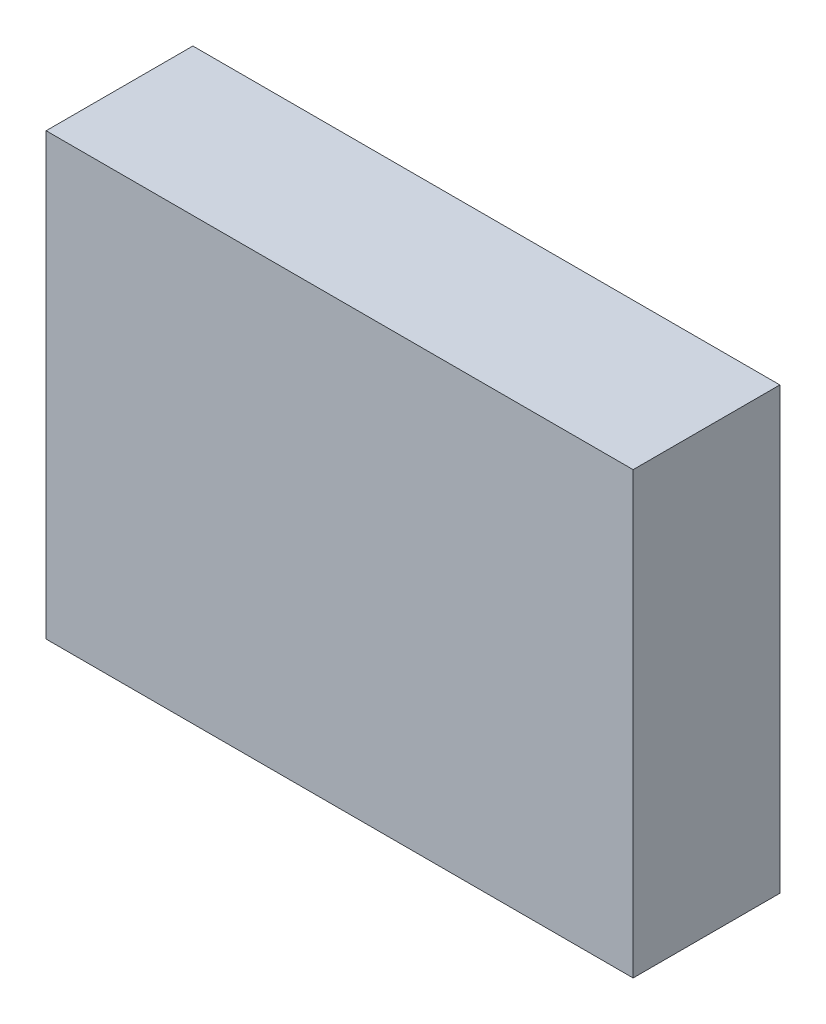
ISO-10303-21;
HEADER;
FILE_DESCRIPTION(('STEP AP214'),'2;1');
FILE_NAME('part.step','',(''),(''),'','','');
FILE_SCHEMA(('AUTOMOTIVE_DESIGN { 1 0 10303 214 1 1 1 1 }'));
ENDSEC;
DATA;
#1=APPLICATION_CONTEXT('core data for automotive mechanical design processes');
#2=APPLICATION_PROTOCOL_DEFINITION('international standard','automotive_design',2000,#1);
#3=PRODUCT_CONTEXT('',#1,'mechanical');
#4=PRODUCT('Part','Part','',(#3));
#5=PRODUCT_RELATED_PRODUCT_CATEGORY('part','',(#4));
#6=PRODUCT_DEFINITION_FORMATION('','',#4);
#7=PRODUCT_DEFINITION_CONTEXT('part definition',#1,'design');
#8=PRODUCT_DEFINITION('design','',#6,#7);
#9=PRODUCT_DEFINITION_SHAPE('','',#8);
#10=(LENGTH_UNIT() NAMED_UNIT(*) SI_UNIT(.MILLI.,.METRE.));
#11=(NAMED_UNIT(*) PLANE_ANGLE_UNIT() SI_UNIT($,.RADIAN.));
#12=(NAMED_UNIT(*) SI_UNIT($,.STERADIAN.) SOLID_ANGLE_UNIT());
#13=UNCERTAINTY_MEASURE_WITH_UNIT(LENGTH_MEASURE(1.E-05),#10,'distance_accuracy_value','');
#14=(GEOMETRIC_REPRESENTATION_CONTEXT(3) GLOBAL_UNCERTAINTY_ASSIGNED_CONTEXT((#13)) GLOBAL_UNIT_ASSIGNED_CONTEXT((#10,
#11,#12)) REPRESENTATION_CONTEXT('',''));
#15=CARTESIAN_POINT('',(0.,0.,0.));
#16=DIRECTION('',(0.,0.,1.));
#17=DIRECTION('',(1.,0.,0.));
#18=AXIS2_PLACEMENT_3D('',#15,#16,#17);
#19=CARTESIAN_POINT('',(-60.,0.,0.));
#20=DIRECTION('',(0.,-1.,0.));
#21=DIRECTION('',(0.,0.,-1.));
#22=AXIS2_PLACEMENT_3D('',#19,#20,#21);
#23=PLANE('',#22);
#24=DIRECTION('',(1.,0.,0.));
#25=VECTOR('',#24,1.);
#26=CARTESIAN_POINT('',(-60.,0.,30.));
#27=LINE('',#26,#25);
#28=CARTESIAN_POINT('',(-60.,0.,30.));
#29=VERTEX_POINT('',#28);
#30=CARTESIAN_POINT('',(60.,0.,30.));
#31=VERTEX_POINT('',#30);
#32=EDGE_CURVE('E46',#29,#31,#27,.T.);
#33=ORIENTED_EDGE('',*,*,#32,.T.);
#34=DIRECTION('',(0.,0.,-1.));
#35=VECTOR('',#34,1.);
#36=CARTESIAN_POINT('',(60.,0.,0.));
#37=LINE('',#36,#35);
#38=CARTESIAN_POINT('',(60.,0.,0.));
#39=VERTEX_POINT('',#38);
#40=EDGE_CURVE('E190',#31,#39,#37,.T.);
#41=ORIENTED_EDGE('',*,*,#40,.T.);
#42=DIRECTION('',(1.,0.,0.));
#43=VECTOR('',#42,1.);
#44=CARTESIAN_POINT('',(-60.,0.,0.));
#45=LINE('',#44,#43);
#46=CARTESIAN_POINT('',(-60.,0.,0.));
#47=VERTEX_POINT('',#46);
#48=EDGE_CURVE('E11',#47,#39,#45,.T.);
#49=ORIENTED_EDGE('',*,*,#48,.F.);
#50=DIRECTION('',(0.,0.,-1.));
#51=VECTOR('',#50,1.);
#52=CARTESIAN_POINT('',(-60.,0.,0.));
#53=LINE('',#52,#51);
#54=EDGE_CURVE('E56',#29,#47,#53,.T.);
#55=ORIENTED_EDGE('',*,*,#54,.F.);
#56=EDGE_LOOP('',(#33,#41,#49,#55));
#57=FACE_BOUND('',#56,.T.);
#58=ADVANCED_FACE('F43',(#57),#23,.F.);
#59=CARTESIAN_POINT('',(-60.,0.,0.));
#60=DIRECTION('',(0.,0.,-1.));
#61=DIRECTION('',(0.,1.,0.));
#62=AXIS2_PLACEMENT_3D('',#59,#60,#61);
#63=PLANE('',#62);
#64=CARTESIAN_POINT('',(-2.99999999999999,-17.5,0.));
#65=DIRECTION('',(0.,0.,-1.));
#66=DIRECTION('',(0.,1.,0.));
#67=AXIS2_PLACEMENT_3D('',#64,#65,#66);
#68=CIRCLE('',#67,1.025);
#69=CARTESIAN_POINT('',(-2.99999999999999,-16.475,0.));
#70=VERTEX_POINT('',#69);
#71=EDGE_CURVE('E121',#70,#70,#68,.T.);
#72=ORIENTED_EDGE('',*,*,#71,.F.);
#73=EDGE_LOOP('',(#72));
#74=FACE_BOUND('',#73,.T.);
#75=CARTESIAN_POINT('',(3.00000000000001,-17.5,0.));
#76=DIRECTION('',(0.,0.,-1.));
#77=DIRECTION('',(0.,1.,0.));
#78=AXIS2_PLACEMENT_3D('',#75,#76,#77);
#79=CIRCLE('',#78,1.025);
#80=CARTESIAN_POINT('',(3.00000000000001,-16.475,0.));
#81=VERTEX_POINT('',#80);
#82=EDGE_CURVE('E120',#81,#81,#79,.T.);
#83=ORIENTED_EDGE('',*,*,#82,.F.);
#84=EDGE_LOOP('',(#83));
#85=FACE_BOUND('',#84,.T.);
#86=CARTESIAN_POINT('',(3.00000000000001,-2.50000000000004,0.));
#87=DIRECTION('',(0.,0.,-1.));
#88=DIRECTION('',(0.,1.,0.));
#89=AXIS2_PLACEMENT_3D('',#86,#87,#88);
#90=CIRCLE('',#89,1.025);
#91=CARTESIAN_POINT('',(3.00000000000001,-1.47500000000004,0.));
#92=VERTEX_POINT('',#91);
#93=EDGE_CURVE('E131',#92,#92,#90,.T.);
#94=ORIENTED_EDGE('',*,*,#93,.F.);
#95=EDGE_LOOP('',(#94));
#96=FACE_BOUND('',#95,.T.);
#97=CARTESIAN_POINT('',(-2.99999999999999,-2.50000000000004,0.));
#98=DIRECTION('',(0.,0.,-1.));
#99=DIRECTION('',(0.,1.,0.));
#100=AXIS2_PLACEMENT_3D('',#97,#98,#99);
#101=CIRCLE('',#100,1.025);
#102=CARTESIAN_POINT('',(-2.99999999999999,-1.47500000000004,0.));
#103=VERTEX_POINT('',#102);
#104=EDGE_CURVE('E145',#103,#103,#101,.T.);
#105=ORIENTED_EDGE('',*,*,#104,.F.);
#106=EDGE_LOOP('',(#105));
#107=FACE_BOUND('',#106,.T.);
#108=CARTESIAN_POINT('',(-7.49999999999999,-61.,0.));
#109=DIRECTION('',(0.,0.,-1.));
#110=DIRECTION('',(0.,1.,0.));
#111=AXIS2_PLACEMENT_3D('',#108,#109,#110);
#112=CIRCLE('',#111,1.025);
#113=CARTESIAN_POINT('',(-7.49999999999999,-59.975,0.));
#114=VERTEX_POINT('',#113);
#115=EDGE_CURVE('E153',#114,#114,#112,.T.);
#116=ORIENTED_EDGE('',*,*,#115,.F.);
#117=EDGE_LOOP('',(#116));
#118=FACE_BOUND('',#117,.T.);
#119=CARTESIAN_POINT('',(-7.49999999999999,-29.,0.));
#120=DIRECTION('',(0.,0.,-1.));
#121=DIRECTION('',(0.,1.,0.));
#122=AXIS2_PLACEMENT_3D('',#119,#120,#121);
#123=CIRCLE('',#122,1.025);
#124=CARTESIAN_POINT('',(-7.49999999999999,-27.975,0.));
#125=VERTEX_POINT('',#124);
#126=EDGE_CURVE('E159',#125,#125,#123,.T.);
#127=ORIENTED_EDGE('',*,*,#126,.F.);
#128=EDGE_LOOP('',(#127));
#129=FACE_BOUND('',#128,.T.);
#130=CARTESIAN_POINT('',(7.50000000000001,-61.,0.));
#131=DIRECTION('',(0.,0.,-1.));
#132=DIRECTION('',(0.,1.,0.));
#133=AXIS2_PLACEMENT_3D('',#130,#131,#132);
#134=CIRCLE('',#133,1.025);
#135=CARTESIAN_POINT('',(7.50000000000001,-59.975,0.));
#136=VERTEX_POINT('',#135);
#137=EDGE_CURVE('E169',#136,#136,#134,.T.);
#138=ORIENTED_EDGE('',*,*,#137,.F.);
#139=EDGE_LOOP('',(#138));
#140=FACE_BOUND('',#139,.T.);
#141=CARTESIAN_POINT('',(7.50000000000001,-29.,0.));
#142=DIRECTION('',(0.,0.,-1.));
#143=DIRECTION('',(0.,1.,0.));
#144=AXIS2_PLACEMENT_3D('',#141,#142,#143);
#145=CIRCLE('',#144,1.025);
#146=CARTESIAN_POINT('',(7.50000000000001,-27.975,0.));
#147=VERTEX_POINT('',#146);
#148=EDGE_CURVE('E178',#147,#147,#145,.T.);
#149=ORIENTED_EDGE('',*,*,#148,.F.);
#150=EDGE_LOOP('',(#149));
#151=FACE_BOUND('',#150,.T.);
#152=ORIENTED_EDGE('',*,*,#48,.T.);
#153=DIRECTION('',(0.,1.,0.));
#154=VECTOR('',#153,1.);
#155=CARTESIAN_POINT('',(60.,0.,0.));
#156=LINE('',#155,#154);
#157=CARTESIAN_POINT('',(60.,-90.,0.));
#158=VERTEX_POINT('',#157);
#159=EDGE_CURVE('E198',#158,#39,#156,.T.);
#160=ORIENTED_EDGE('',*,*,#159,.F.);
#161=DIRECTION('',(1.,0.,0.));
#162=VECTOR('',#161,1.);
#163=CARTESIAN_POINT('',(-60.,-90.,0.));
#164=LINE('',#163,#162);
#165=CARTESIAN_POINT('',(-60.,-90.,0.));
#166=VERTEX_POINT('',#165);
#167=EDGE_CURVE('E51',#166,#158,#164,.T.);
#168=ORIENTED_EDGE('',*,*,#167,.F.);
#169=DIRECTION('',(0.,1.,0.));
#170=VECTOR('',#169,1.);
#171=CARTESIAN_POINT('',(-60.,0.,0.));
#172=LINE('',#171,#170);
#173=EDGE_CURVE('E203',#166,#47,#172,.T.);
#174=ORIENTED_EDGE('',*,*,#173,.T.);
#175=EDGE_LOOP('',(#152,#160,#168,#174));
#176=FACE_BOUND('',#175,.T.);
#177=ADVANCED_FACE('F224',(#74,#85,#96,#107,#118,#129,#140,#151,#176),#63,.T.);
#178=CARTESIAN_POINT('',(-60.,-90.,0.));
#179=DIRECTION('',(0.,-1.,0.));
#180=DIRECTION('',(0.,0.,-1.));
#181=AXIS2_PLACEMENT_3D('',#178,#179,#180);
#182=PLANE('',#181);
#183=ORIENTED_EDGE('',*,*,#167,.T.);
#184=DIRECTION('',(0.,0.,-1.));
#185=VECTOR('',#184,1.);
#186=CARTESIAN_POINT('',(60.,-90.,0.));
#187=LINE('',#186,#185);
#188=CARTESIAN_POINT('',(60.,-90.,30.));
#189=VERTEX_POINT('',#188);
#190=EDGE_CURVE('E195',#189,#158,#187,.T.);
#191=ORIENTED_EDGE('',*,*,#190,.F.);
#192=DIRECTION('',(1.,0.,0.));
#193=VECTOR('',#192,1.);
#194=CARTESIAN_POINT('',(-60.,-90.,30.));
#195=LINE('',#194,#193);
#196=CARTESIAN_POINT('',(-60.,-90.,30.));
#197=VERTEX_POINT('',#196);
#198=EDGE_CURVE('E207',#197,#189,#195,.T.);
#199=ORIENTED_EDGE('',*,*,#198,.F.);
#200=DIRECTION('',(0.,0.,-1.));
#201=VECTOR('',#200,1.);
#202=CARTESIAN_POINT('',(-60.,-90.,0.));
#203=LINE('',#202,#201);
#204=EDGE_CURVE('E205',#197,#166,#203,.T.);
#205=ORIENTED_EDGE('',*,*,#204,.T.);
#206=EDGE_LOOP('',(#183,#191,#199,#205));
#207=FACE_BOUND('',#206,.T.);
#208=ADVANCED_FACE('F217',(#207),#182,.T.);
#209=CARTESIAN_POINT('',(-60.,0.,30.));
#210=DIRECTION('',(0.,0.,-1.));
#211=DIRECTION('',(-1.,0.,0.));
#212=AXIS2_PLACEMENT_3D('',#209,#210,#211);
#213=PLANE('',#212);
#214=ORIENTED_EDGE('',*,*,#198,.T.);
#215=DIRECTION('',(0.,1.,0.));
#216=VECTOR('',#215,1.);
#217=CARTESIAN_POINT('',(60.,0.,30.));
#218=LINE('',#217,#216);
#219=EDGE_CURVE('E188',#189,#31,#218,.T.);
#220=ORIENTED_EDGE('',*,*,#219,.T.);
#221=ORIENTED_EDGE('',*,*,#32,.F.);
#222=DIRECTION('',(0.,1.,0.));
#223=VECTOR('',#222,1.);
#224=CARTESIAN_POINT('',(-60.,0.,30.));
#225=LINE('',#224,#223);
#226=EDGE_CURVE('E199',#197,#29,#225,.T.);
#227=ORIENTED_EDGE('',*,*,#226,.F.);
#228=EDGE_LOOP('',(#214,#220,#221,#227));
#229=FACE_BOUND('',#228,.T.);
#230=ADVANCED_FACE('F218',(#229),#213,.F.);
#231=CARTESIAN_POINT('',(-60.,0.,0.));
#232=DIRECTION('',(1.,0.,0.));
#233=DIRECTION('',(0.,0.,-1.));
#234=AXIS2_PLACEMENT_3D('',#231,#232,#233);
#235=PLANE('',#234);
#236=ORIENTED_EDGE('',*,*,#54,.T.);
#237=ORIENTED_EDGE('',*,*,#173,.F.);
#238=ORIENTED_EDGE('',*,*,#204,.F.);
#239=ORIENTED_EDGE('',*,*,#226,.T.);
#240=EDGE_LOOP('',(#236,#237,#238,#239));
#241=FACE_BOUND('',#240,.T.);
#242=ADVANCED_FACE('F216',(#241),#235,.F.);
#243=CARTESIAN_POINT('',(60.,0.,0.));
#244=DIRECTION('',(1.,0.,0.));
#245=DIRECTION('',(0.,0.,-1.));
#246=AXIS2_PLACEMENT_3D('',#243,#244,#245);
#247=PLANE('',#246);
#248=ORIENTED_EDGE('',*,*,#40,.F.);
#249=ORIENTED_EDGE('',*,*,#219,.F.);
#250=ORIENTED_EDGE('',*,*,#190,.T.);
#251=ORIENTED_EDGE('',*,*,#159,.T.);
#252=EDGE_LOOP('',(#248,#249,#250,#251));
#253=FACE_BOUND('',#252,.T.);
#254=ADVANCED_FACE('F212',(#253),#247,.T.);
#255=CARTESIAN_POINT('',(7.50000000000001,-29.,10.));
#256=DIRECTION('',(0.,0.,-1.));
#257=DIRECTION('',(0.,1.,0.));
#258=AXIS2_PLACEMENT_3D('',#255,#256,#257);
#259=CONICAL_SURFACE('',#258,0.999999999999997,1.02974425867665);
#260=CARTESIAN_POINT('',(7.5,-29.,10.6008606190276));
#261=VERTEX_POINT('',#260);
#262=VERTEX_LOOP('',#261);
#263=FACE_BOUND('',#262,.T.);
#264=CARTESIAN_POINT('',(7.50000000000001,-29.,10.));
#265=DIRECTION('',(0.,0.,-1.));
#266=DIRECTION('',(0.,1.,0.));
#267=AXIS2_PLACEMENT_3D('',#264,#265,#266);
#268=CIRCLE('',#267,0.999999999999997);
#269=CARTESIAN_POINT('',(7.50000000000001,-28.,10.));
#270=VERTEX_POINT('',#269);
#271=EDGE_CURVE('E183',#270,#270,#268,.T.);
#272=ORIENTED_EDGE('',*,*,#271,.T.);
#273=EDGE_LOOP('',(#272));
#274=FACE_BOUND('',#273,.T.);
#275=ADVANCED_FACE('F243',(#263,#274),#259,.F.);
#276=CARTESIAN_POINT('',(7.50000000000001,-29.,0.));
#277=DIRECTION('',(0.,0.,-1.));
#278=DIRECTION('',(0.,1.,0.));
#279=AXIS2_PLACEMENT_3D('',#276,#277,#278);
#280=CYLINDRICAL_SURFACE('',#279,0.999999999999992);
#281=ORIENTED_EDGE('',*,*,#271,.F.);
#282=EDGE_LOOP('',(#281));
#283=FACE_BOUND('',#282,.T.);
#284=CARTESIAN_POINT('',(7.50000000000001,-29.,0.0250000000000253));
#285=DIRECTION('',(0.,0.,-1.));
#286=DIRECTION('',(0.,1.,0.));
#287=AXIS2_PLACEMENT_3D('',#284,#285,#286);
#288=CIRCLE('',#287,0.999999999999988);
#289=CARTESIAN_POINT('',(7.50000000000001,-28.0000000000001,0.0250000000000248));
#290=VERTEX_POINT('',#289);
#291=EDGE_CURVE('E181',#290,#290,#288,.T.);
#292=ORIENTED_EDGE('',*,*,#291,.T.);
#293=EDGE_LOOP('',(#292));
#294=FACE_BOUND('',#293,.T.);
#295=ADVANCED_FACE('F246',(#283,#294),#280,.F.);
#296=CARTESIAN_POINT('',(7.50000000000001,-29.,0.));
#297=DIRECTION('',(0.,0.,-1.));
#298=DIRECTION('',(0.,1.,0.));
#299=AXIS2_PLACEMENT_3D('',#296,#297,#298);
#300=CONICAL_SURFACE('',#299,1.025,0.785398163397414);
#301=ORIENTED_EDGE('',*,*,#291,.F.);
#302=EDGE_LOOP('',(#301));
#303=FACE_BOUND('',#302,.T.);
#304=ORIENTED_EDGE('',*,*,#148,.T.);
#305=EDGE_LOOP('',(#304));
#306=FACE_BOUND('',#305,.T.);
#307=ADVANCED_FACE('F249',(#303,#306),#300,.F.);
#308=CARTESIAN_POINT('',(7.50000000000001,-61.,10.));
#309=DIRECTION('',(0.,0.,-1.));
#310=DIRECTION('',(0.,1.,0.));
#311=AXIS2_PLACEMENT_3D('',#308,#309,#310);
#312=CONICAL_SURFACE('',#311,0.999999999999997,1.02974425867665);
#313=CARTESIAN_POINT('',(7.5,-61.,10.6008606190276));
#314=VERTEX_POINT('',#313);
#315=VERTEX_LOOP('',#314);
#316=FACE_BOUND('',#315,.T.);
#317=CARTESIAN_POINT('',(7.50000000000001,-61.,10.));
#318=DIRECTION('',(0.,0.,-1.));
#319=DIRECTION('',(0.,1.,0.));
#320=AXIS2_PLACEMENT_3D('',#317,#318,#319);
#321=CIRCLE('',#320,0.999999999999997);
#322=CARTESIAN_POINT('',(7.50000000000001,-60.,10.));
#323=VERTEX_POINT('',#322);
#324=EDGE_CURVE('E174',#323,#323,#321,.T.);
#325=ORIENTED_EDGE('',*,*,#324,.T.);
#326=EDGE_LOOP('',(#325));
#327=FACE_BOUND('',#326,.T.);
#328=ADVANCED_FACE('F251',(#316,#327),#312,.F.);
#329=CARTESIAN_POINT('',(7.50000000000001,-61.,0.));
#330=DIRECTION('',(0.,0.,-1.));
#331=DIRECTION('',(0.,1.,0.));
#332=AXIS2_PLACEMENT_3D('',#329,#330,#331);
#333=CYLINDRICAL_SURFACE('',#332,0.999999999999992);
#334=ORIENTED_EDGE('',*,*,#324,.F.);
#335=EDGE_LOOP('',(#334));
#336=FACE_BOUND('',#335,.T.);
#337=CARTESIAN_POINT('',(7.50000000000001,-61.,0.025000000000041));
#338=DIRECTION('',(0.,0.,-1.));
#339=DIRECTION('',(0.,1.,0.));
#340=AXIS2_PLACEMENT_3D('',#337,#338,#339);
#341=CIRCLE('',#340,0.999999999999988);
#342=CARTESIAN_POINT('',(7.50000000000001,-60.0000000000001,0.0250000000000405));
#343=VERTEX_POINT('',#342);
#344=EDGE_CURVE('E175',#343,#343,#341,.T.);
#345=ORIENTED_EDGE('',*,*,#344,.T.);
#346=EDGE_LOOP('',(#345));
#347=FACE_BOUND('',#346,.T.);
#348=ADVANCED_FACE('F260',(#336,#347),#333,.F.);
#349=CARTESIAN_POINT('',(7.50000000000001,-61.,0.));
#350=DIRECTION('',(0.,0.,-1.));
#351=DIRECTION('',(0.,1.,0.));
#352=AXIS2_PLACEMENT_3D('',#349,#350,#351);
#353=CONICAL_SURFACE('',#352,1.025,0.785398163397414);
#354=ORIENTED_EDGE('',*,*,#344,.F.);
#355=EDGE_LOOP('',(#354));
#356=FACE_BOUND('',#355,.T.);
#357=ORIENTED_EDGE('',*,*,#137,.T.);
#358=EDGE_LOOP('',(#357));
#359=FACE_BOUND('',#358,.T.);
#360=ADVANCED_FACE('F265',(#356,#359),#353,.F.);
#361=CARTESIAN_POINT('',(-7.49999999999999,-29.,10.));
#362=DIRECTION('',(0.,0.,-1.));
#363=DIRECTION('',(0.,1.,0.));
#364=AXIS2_PLACEMENT_3D('',#361,#362,#363);
#365=CONICAL_SURFACE('',#364,0.999999999999997,1.02974425867665);
#366=CARTESIAN_POINT('',(-7.49999999999999,-29.,10.6008606190276));
#367=VERTEX_POINT('',#366);
#368=VERTEX_LOOP('',#367);
#369=FACE_BOUND('',#368,.T.);
#370=CARTESIAN_POINT('',(-7.49999999999999,-29.,10.));
#371=DIRECTION('',(0.,0.,-1.));
#372=DIRECTION('',(0.,1.,0.));
#373=AXIS2_PLACEMENT_3D('',#370,#371,#372);
#374=CIRCLE('',#373,0.999999999999997);
#375=CARTESIAN_POINT('',(-7.49999999999999,-28.,10.));
#376=VERTEX_POINT('',#375);
#377=EDGE_CURVE('E168',#376,#376,#374,.T.);
#378=ORIENTED_EDGE('',*,*,#377,.T.);
#379=EDGE_LOOP('',(#378));
#380=FACE_BOUND('',#379,.T.);
#381=ADVANCED_FACE('F266',(#369,#380),#365,.F.);
#382=CARTESIAN_POINT('',(-7.49999999999999,-29.,0.));
#383=DIRECTION('',(0.,0.,-1.));
#384=DIRECTION('',(0.,1.,0.));
#385=AXIS2_PLACEMENT_3D('',#382,#383,#384);
#386=CYLINDRICAL_SURFACE('',#385,0.999999999999993);
#387=ORIENTED_EDGE('',*,*,#377,.F.);
#388=EDGE_LOOP('',(#387));
#389=FACE_BOUND('',#388,.T.);
#390=CARTESIAN_POINT('',(-7.49999999999999,-29.,0.0250000000000253));
#391=DIRECTION('',(0.,0.,-1.));
#392=DIRECTION('',(0.,1.,0.));
#393=AXIS2_PLACEMENT_3D('',#390,#391,#392);
#394=CIRCLE('',#393,0.999999999999989);
#395=CARTESIAN_POINT('',(-7.49999999999999,-28.0000000000001,0.0250000000000248));
#396=VERTEX_POINT('',#395);
#397=EDGE_CURVE('E161',#396,#396,#394,.T.);
#398=ORIENTED_EDGE('',*,*,#397,.T.);
#399=EDGE_LOOP('',(#398));
#400=FACE_BOUND('',#399,.T.);
#401=ADVANCED_FACE('F269',(#389,#400),#386,.F.);
#402=CARTESIAN_POINT('',(-7.49999999999999,-29.,0.));
#403=DIRECTION('',(0.,0.,-1.));
#404=DIRECTION('',(0.,1.,0.));
#405=AXIS2_PLACEMENT_3D('',#402,#403,#404);
#406=CONICAL_SURFACE('',#405,1.025,0.785398163397414);
#407=ORIENTED_EDGE('',*,*,#397,.F.);
#408=EDGE_LOOP('',(#407));
#409=FACE_BOUND('',#408,.T.);
#410=ORIENTED_EDGE('',*,*,#126,.T.);
#411=EDGE_LOOP('',(#410));
#412=FACE_BOUND('',#411,.T.);
#413=ADVANCED_FACE('F274',(#409,#412),#406,.F.);
#414=CARTESIAN_POINT('',(-7.49999999999999,-61.,10.));
#415=DIRECTION('',(0.,0.,-1.));
#416=DIRECTION('',(0.,1.,0.));
#417=AXIS2_PLACEMENT_3D('',#414,#415,#416);
#418=CONICAL_SURFACE('',#417,0.999999999999997,1.02974425867665);
#419=CARTESIAN_POINT('',(-7.49999999999999,-61.,10.6008606190276));
#420=VERTEX_POINT('',#419);
#421=VERTEX_LOOP('',#420);
#422=FACE_BOUND('',#421,.T.);
#423=CARTESIAN_POINT('',(-7.49999999999999,-61.,10.));
#424=DIRECTION('',(0.,0.,-1.));
#425=DIRECTION('',(0.,1.,0.));
#426=AXIS2_PLACEMENT_3D('',#423,#424,#425);
#427=CIRCLE('',#426,0.999999999999997);
#428=CARTESIAN_POINT('',(-7.49999999999999,-60.,10.));
#429=VERTEX_POINT('',#428);
#430=EDGE_CURVE('E160',#429,#429,#427,.T.);
#431=ORIENTED_EDGE('',*,*,#430,.T.);
#432=EDGE_LOOP('',(#431));
#433=FACE_BOUND('',#432,.T.);
#434=ADVANCED_FACE('F280',(#422,#433),#418,.F.);
#435=CARTESIAN_POINT('',(-7.49999999999999,-61.,0.));
#436=DIRECTION('',(0.,0.,-1.));
#437=DIRECTION('',(0.,1.,0.));
#438=AXIS2_PLACEMENT_3D('',#435,#436,#437);
#439=CYLINDRICAL_SURFACE('',#438,0.999999999999993);
#440=ORIENTED_EDGE('',*,*,#430,.F.);
#441=EDGE_LOOP('',(#440));
#442=FACE_BOUND('',#441,.T.);
#443=CARTESIAN_POINT('',(-7.49999999999999,-61.,0.025000000000041));
#444=DIRECTION('',(0.,0.,-1.));
#445=DIRECTION('',(0.,1.,0.));
#446=AXIS2_PLACEMENT_3D('',#443,#444,#445);
#447=CIRCLE('',#446,0.999999999999989);
#448=CARTESIAN_POINT('',(-7.49999999999999,-60.0000000000001,0.0250000000000405));
#449=VERTEX_POINT('',#448);
#450=EDGE_CURVE('E152',#449,#449,#447,.T.);
#451=ORIENTED_EDGE('',*,*,#450,.T.);
#452=EDGE_LOOP('',(#451));
#453=FACE_BOUND('',#452,.T.);
#454=ADVANCED_FACE('F285',(#442,#453),#439,.F.);
#455=CARTESIAN_POINT('',(-7.49999999999999,-61.,0.));
#456=DIRECTION('',(0.,0.,-1.));
#457=DIRECTION('',(0.,1.,0.));
#458=AXIS2_PLACEMENT_3D('',#455,#456,#457);
#459=CONICAL_SURFACE('',#458,1.025,0.785398163397414);
#460=ORIENTED_EDGE('',*,*,#450,.F.);
#461=EDGE_LOOP('',(#460));
#462=FACE_BOUND('',#461,.T.);
#463=ORIENTED_EDGE('',*,*,#115,.T.);
#464=EDGE_LOOP('',(#463));
#465=FACE_BOUND('',#464,.T.);
#466=ADVANCED_FACE('F286',(#462,#465),#459,.F.);
#467=CARTESIAN_POINT('',(-2.99999999999999,-2.50000000000003,10.));
#468=DIRECTION('',(0.,0.,-1.));
#469=DIRECTION('',(0.,1.,0.));
#470=AXIS2_PLACEMENT_3D('',#467,#468,#469);
#471=CONICAL_SURFACE('',#470,0.999999999999987,1.02974425867664);
#472=CARTESIAN_POINT('',(-2.99999999999999,-2.50000000000003,10.6008606190276));
#473=VERTEX_POINT('',#472);
#474=VERTEX_LOOP('',#473);
#475=FACE_BOUND('',#474,.T.);
#476=CARTESIAN_POINT('',(-2.99999999999999,-2.50000000000003,10.));
#477=DIRECTION('',(0.,0.,-1.));
#478=DIRECTION('',(0.,1.,0.));
#479=AXIS2_PLACEMENT_3D('',#476,#477,#478);
#480=CIRCLE('',#479,0.999999999999987);
#481=CARTESIAN_POINT('',(-2.99999999999999,-1.50000000000005,10.));
#482=VERTEX_POINT('',#481);
#483=EDGE_CURVE('E150',#482,#482,#480,.T.);
#484=ORIENTED_EDGE('',*,*,#483,.T.);
#485=EDGE_LOOP('',(#484));
#486=FACE_BOUND('',#485,.T.);
#487=ADVANCED_FACE('F288',(#475,#486),#471,.F.);
#488=CARTESIAN_POINT('',(-2.99999999999999,-2.50000000000004,0.));
#489=DIRECTION('',(0.,0.,-1.));
#490=DIRECTION('',(0.,1.,0.));
#491=AXIS2_PLACEMENT_3D('',#488,#489,#490);
#492=CYLINDRICAL_SURFACE('',#491,0.999999999999988);
#493=ORIENTED_EDGE('',*,*,#483,.F.);
#494=EDGE_LOOP('',(#493));
#495=FACE_BOUND('',#494,.T.);
#496=CARTESIAN_POINT('',(-2.99999999999999,-2.50000000000004,0.0250000000000123));
#497=DIRECTION('',(0.,0.,-1.));
#498=DIRECTION('',(0.,1.,0.));
#499=AXIS2_PLACEMENT_3D('',#496,#497,#498);
#500=CIRCLE('',#499,0.999999999999989);
#501=CARTESIAN_POINT('',(-2.99999999999999,-1.50000000000005,0.0250000000000119));
#502=VERTEX_POINT('',#501);
#503=EDGE_CURVE('E143',#502,#502,#500,.T.);
#504=ORIENTED_EDGE('',*,*,#503,.T.);
#505=EDGE_LOOP('',(#504));
#506=FACE_BOUND('',#505,.T.);
#507=ADVANCED_FACE('F292',(#495,#506),#492,.F.);
#508=CARTESIAN_POINT('',(-2.99999999999999,-2.50000000000004,0.));
#509=DIRECTION('',(0.,0.,-1.));
#510=DIRECTION('',(0.,1.,0.));
#511=AXIS2_PLACEMENT_3D('',#508,#509,#510);
#512=CONICAL_SURFACE('',#511,1.025,0.785398163397414);
#513=ORIENTED_EDGE('',*,*,#503,.F.);
#514=EDGE_LOOP('',(#513));
#515=FACE_BOUND('',#514,.T.);
#516=ORIENTED_EDGE('',*,*,#104,.T.);
#517=EDGE_LOOP('',(#516));
#518=FACE_BOUND('',#517,.T.);
#519=ADVANCED_FACE('F298',(#515,#518),#512,.F.);
#520=CARTESIAN_POINT('',(3.00000000000001,-2.50000000000003,10.));
#521=DIRECTION('',(0.,0.,-1.));
#522=DIRECTION('',(0.,1.,0.));
#523=AXIS2_PLACEMENT_3D('',#520,#521,#522);
#524=CONICAL_SURFACE('',#523,0.999999999999987,1.02974425867664);
#525=CARTESIAN_POINT('',(3.,-2.50000000000003,10.6008606190276));
#526=VERTEX_POINT('',#525);
#527=VERTEX_LOOP('',#526);
#528=FACE_BOUND('',#527,.T.);
#529=CARTESIAN_POINT('',(3.00000000000001,-2.50000000000003,10.));
#530=DIRECTION('',(0.,0.,-1.));
#531=DIRECTION('',(0.,1.,0.));
#532=AXIS2_PLACEMENT_3D('',#529,#530,#531);
#533=CIRCLE('',#532,0.999999999999987);
#534=CARTESIAN_POINT('',(3.00000000000001,-1.50000000000005,10.));
#535=VERTEX_POINT('',#534);
#536=EDGE_CURVE('E138',#535,#535,#533,.T.);
#537=ORIENTED_EDGE('',*,*,#536,.T.);
#538=EDGE_LOOP('',(#537));
#539=FACE_BOUND('',#538,.T.);
#540=ADVANCED_FACE('F297',(#528,#539),#524,.F.);
#541=CARTESIAN_POINT('',(3.00000000000001,-2.50000000000004,0.));
#542=DIRECTION('',(0.,0.,-1.));
#543=DIRECTION('',(0.,1.,0.));
#544=AXIS2_PLACEMENT_3D('',#541,#542,#543);
#545=CYLINDRICAL_SURFACE('',#544,0.999999999999987);
#546=ORIENTED_EDGE('',*,*,#536,.F.);
#547=EDGE_LOOP('',(#546));
#548=FACE_BOUND('',#547,.T.);
#549=CARTESIAN_POINT('',(3.00000000000001,-2.50000000000004,0.0250000000000123));
#550=DIRECTION('',(0.,0.,-1.));
#551=DIRECTION('',(0.,1.,0.));
#552=AXIS2_PLACEMENT_3D('',#549,#550,#551);
#553=CIRCLE('',#552,0.999999999999988);
#554=CARTESIAN_POINT('',(3.00000000000001,-1.50000000000005,0.0250000000000119));
#555=VERTEX_POINT('',#554);
#556=EDGE_CURVE('E136',#555,#555,#553,.T.);
#557=ORIENTED_EDGE('',*,*,#556,.T.);
#558=EDGE_LOOP('',(#557));
#559=FACE_BOUND('',#558,.T.);
#560=ADVANCED_FACE('F302',(#548,#559),#545,.F.);
#561=CARTESIAN_POINT('',(3.00000000000001,-2.50000000000004,0.));
#562=DIRECTION('',(0.,0.,-1.));
#563=DIRECTION('',(0.,1.,0.));
#564=AXIS2_PLACEMENT_3D('',#561,#562,#563);
#565=CONICAL_SURFACE('',#564,1.025,0.785398163397414);
#566=ORIENTED_EDGE('',*,*,#556,.F.);
#567=EDGE_LOOP('',(#566));
#568=FACE_BOUND('',#567,.T.);
#569=ORIENTED_EDGE('',*,*,#93,.T.);
#570=EDGE_LOOP('',(#569));
#571=FACE_BOUND('',#570,.T.);
#572=ADVANCED_FACE('F308',(#568,#571),#565,.F.);
#573=CARTESIAN_POINT('',(3.00000000000001,-17.5,10.));
#574=DIRECTION('',(0.,0.,-1.));
#575=DIRECTION('',(0.,1.,0.));
#576=AXIS2_PLACEMENT_3D('',#573,#574,#575);
#577=CONICAL_SURFACE('',#576,0.999999999999987,1.02974425867664);
#578=CARTESIAN_POINT('',(3.,-17.5,10.6008606190276));
#579=VERTEX_POINT('',#578);
#580=VERTEX_LOOP('',#579);
#581=FACE_BOUND('',#580,.T.);
#582=CARTESIAN_POINT('',(3.00000000000001,-17.5,10.));
#583=DIRECTION('',(0.,0.,-1.));
#584=DIRECTION('',(0.,1.,0.));
#585=AXIS2_PLACEMENT_3D('',#582,#583,#584);
#586=CIRCLE('',#585,0.999999999999987);
#587=CARTESIAN_POINT('',(3.00000000000001,-16.5,10.));
#588=VERTEX_POINT('',#587);
#589=EDGE_CURVE('E127',#588,#588,#586,.T.);
#590=ORIENTED_EDGE('',*,*,#589,.T.);
#591=EDGE_LOOP('',(#590));
#592=FACE_BOUND('',#591,.T.);
#593=ADVANCED_FACE('F315',(#581,#592),#577,.F.);
#594=CARTESIAN_POINT('',(3.00000000000001,-17.5,0.));
#595=DIRECTION('',(0.,0.,-1.));
#596=DIRECTION('',(0.,1.,0.));
#597=AXIS2_PLACEMENT_3D('',#594,#595,#596);
#598=CYLINDRICAL_SURFACE('',#597,0.999999999999987);
#599=ORIENTED_EDGE('',*,*,#589,.F.);
#600=EDGE_LOOP('',(#599));
#601=FACE_BOUND('',#600,.T.);
#602=CARTESIAN_POINT('',(3.00000000000001,-17.5,0.0250000000000197));
#603=DIRECTION('',(0.,0.,-1.));
#604=DIRECTION('',(0.,1.,0.));
#605=AXIS2_PLACEMENT_3D('',#602,#603,#604);
#606=CIRCLE('',#605,0.999999999999988);
#607=CARTESIAN_POINT('',(3.00000000000001,-16.5,0.0250000000000192));
#608=VERTEX_POINT('',#607);
#609=EDGE_CURVE('E122',#608,#608,#606,.T.);
#610=ORIENTED_EDGE('',*,*,#609,.T.);
#611=EDGE_LOOP('',(#610));
#612=FACE_BOUND('',#611,.T.);
#613=ADVANCED_FACE('F317',(#601,#612),#598,.F.);
#614=CARTESIAN_POINT('',(3.00000000000001,-17.5,0.));
#615=DIRECTION('',(0.,0.,-1.));
#616=DIRECTION('',(0.,1.,0.));
#617=AXIS2_PLACEMENT_3D('',#614,#615,#616);
#618=CONICAL_SURFACE('',#617,1.025,0.785398163397414);
#619=ORIENTED_EDGE('',*,*,#609,.F.);
#620=EDGE_LOOP('',(#619));
#621=FACE_BOUND('',#620,.T.);
#622=ORIENTED_EDGE('',*,*,#82,.T.);
#623=EDGE_LOOP('',(#622));
#624=FACE_BOUND('',#623,.T.);
#625=ADVANCED_FACE('F111',(#621,#624),#618,.F.);
#626=CARTESIAN_POINT('',(-2.99999999999999,-17.5,10.));
#627=DIRECTION('',(0.,0.,-1.));
#628=DIRECTION('',(0.,1.,0.));
#629=AXIS2_PLACEMENT_3D('',#626,#627,#628);
#630=CONICAL_SURFACE('',#629,0.999999999999987,1.02974425867664);
#631=CARTESIAN_POINT('',(-2.99999999999999,-17.5,10.6008606190276));
#632=VERTEX_POINT('',#631);
#633=VERTEX_LOOP('',#632);
#634=FACE_BOUND('',#633,.T.);
#635=CARTESIAN_POINT('',(-2.99999999999999,-17.5,10.));
#636=DIRECTION('',(0.,0.,-1.));
#637=DIRECTION('',(0.,1.,0.));
#638=AXIS2_PLACEMENT_3D('',#635,#636,#637);
#639=CIRCLE('',#638,0.999999999999987);
#640=CARTESIAN_POINT('',(-2.99999999999999,-16.5,10.));
#641=VERTEX_POINT('',#640);
#642=EDGE_CURVE('E114',#641,#641,#639,.T.);
#643=ORIENTED_EDGE('',*,*,#642,.T.);
#644=EDGE_LOOP('',(#643));
#645=FACE_BOUND('',#644,.T.);
#646=ADVANCED_FACE('F110',(#634,#645),#630,.F.);
#647=CARTESIAN_POINT('',(-2.99999999999999,-17.5,0.));
#648=DIRECTION('',(0.,0.,-1.));
#649=DIRECTION('',(0.,1.,0.));
#650=AXIS2_PLACEMENT_3D('',#647,#648,#649);
#651=CYLINDRICAL_SURFACE('',#650,0.999999999999988);
#652=ORIENTED_EDGE('',*,*,#642,.F.);
#653=EDGE_LOOP('',(#652));
#654=FACE_BOUND('',#653,.T.);
#655=CARTESIAN_POINT('',(-2.99999999999999,-17.5,0.0250000000000197));
#656=DIRECTION('',(0.,0.,-1.));
#657=DIRECTION('',(0.,1.,0.));
#658=AXIS2_PLACEMENT_3D('',#655,#656,#657);
#659=CIRCLE('',#658,0.999999999999989);
#660=CARTESIAN_POINT('',(-2.99999999999999,-16.5,0.0250000000000192));
#661=VERTEX_POINT('',#660);
#662=EDGE_CURVE('E117',#661,#661,#659,.T.);
#663=ORIENTED_EDGE('',*,*,#662,.T.);
#664=EDGE_LOOP('',(#663));
#665=FACE_BOUND('',#664,.T.);
#666=ADVANCED_FACE('F109',(#654,#665),#651,.F.);
#667=CARTESIAN_POINT('',(-2.99999999999999,-17.5,0.));
#668=DIRECTION('',(0.,0.,-1.));
#669=DIRECTION('',(0.,1.,0.));
#670=AXIS2_PLACEMENT_3D('',#667,#668,#669);
#671=CONICAL_SURFACE('',#670,1.025,0.785398163397414);
#672=ORIENTED_EDGE('',*,*,#662,.F.);
#673=EDGE_LOOP('',(#672));
#674=FACE_BOUND('',#673,.T.);
#675=ORIENTED_EDGE('',*,*,#71,.T.);
#676=EDGE_LOOP('',(#675));
#677=FACE_BOUND('',#676,.T.);
#678=ADVANCED_FACE('F328',(#674,#677),#671,.F.);
#679=CLOSED_SHELL('',(#58,#177,#208,#230,#242,#254,#275,#295,#307,#328,#348,#360,#381,#401,#413,
#434,#454,#466,#487,#507,#519,#540,#560,#572,#593,#613,#625,#646,#666,#678));
#680=MANIFOLD_SOLID_BREP('B2',#679);
#681=ADVANCED_BREP_SHAPE_REPRESENTATION('',(#18,#680),#14);
#682=SHAPE_DEFINITION_REPRESENTATION(#9,#681);
ENDSEC;
END-ISO-10303-21;
